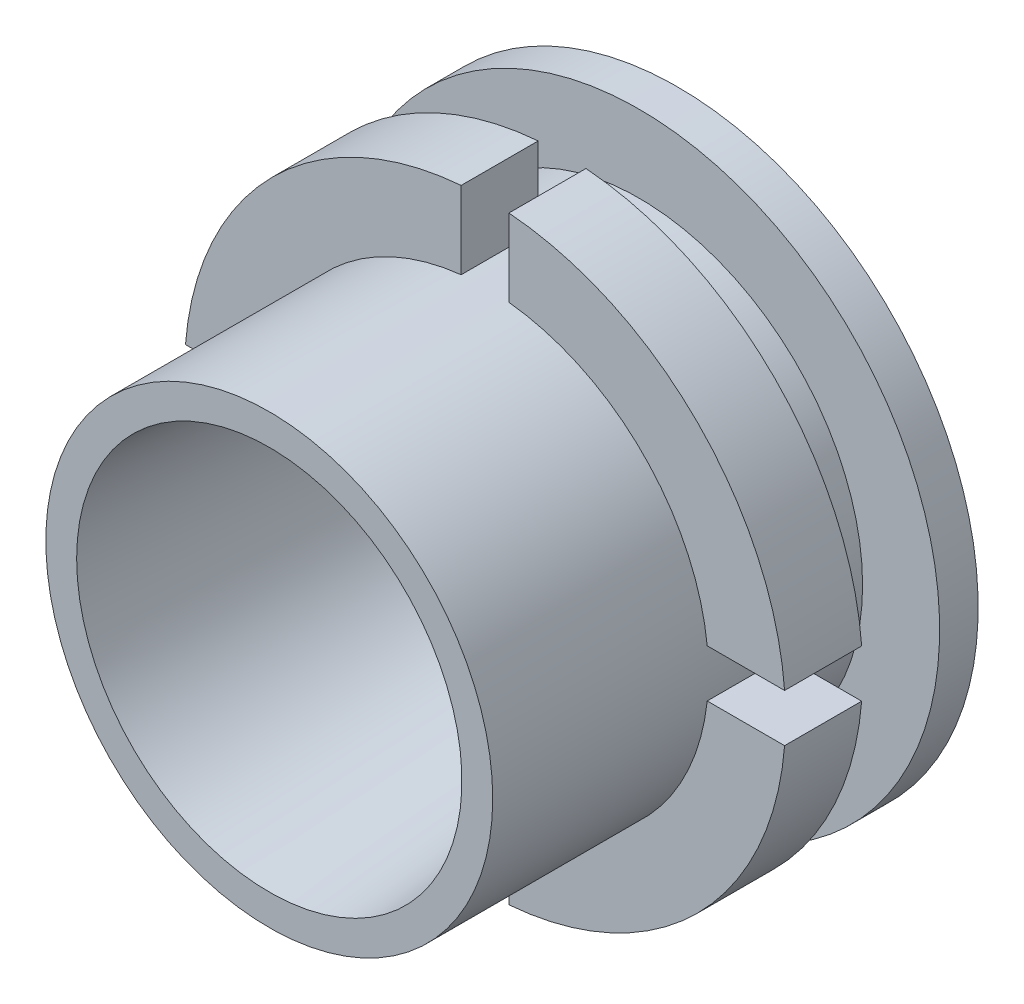
ISO-10303-21;
HEADER;
FILE_DESCRIPTION(('STEP AP214'),'2;1');
FILE_NAME('part.step','',(''),(''),'','','');
FILE_SCHEMA(('AUTOMOTIVE_DESIGN { 1 0 10303 214 1 1 1 1 }'));
ENDSEC;
DATA;
#1=APPLICATION_CONTEXT('core data for automotive mechanical design processes');
#2=APPLICATION_PROTOCOL_DEFINITION('international standard','automotive_design',2000,#1);
#3=PRODUCT_CONTEXT('',#1,'mechanical');
#4=PRODUCT('Part','Part','',(#3));
#5=PRODUCT_RELATED_PRODUCT_CATEGORY('part','',(#4));
#6=PRODUCT_DEFINITION_FORMATION('','',#4);
#7=PRODUCT_DEFINITION_CONTEXT('part definition',#1,'design');
#8=PRODUCT_DEFINITION('design','',#6,#7);
#9=PRODUCT_DEFINITION_SHAPE('','',#8);
#10=(LENGTH_UNIT() NAMED_UNIT(*) SI_UNIT(.MILLI.,.METRE.));
#11=(NAMED_UNIT(*) PLANE_ANGLE_UNIT() SI_UNIT($,.RADIAN.));
#12=(NAMED_UNIT(*) SI_UNIT($,.STERADIAN.) SOLID_ANGLE_UNIT());
#13=UNCERTAINTY_MEASURE_WITH_UNIT(LENGTH_MEASURE(1.E-05),#10,'distance_accuracy_value','');
#14=(GEOMETRIC_REPRESENTATION_CONTEXT(3) GLOBAL_UNCERTAINTY_ASSIGNED_CONTEXT((#13)) GLOBAL_UNIT_ASSIGNED_CONTEXT((#10,
#11,#12)) REPRESENTATION_CONTEXT('',''));
#15=CARTESIAN_POINT('',(0.,0.,0.));
#16=DIRECTION('',(0.,0.,1.));
#17=DIRECTION('',(1.,0.,0.));
#18=AXIS2_PLACEMENT_3D('',#15,#16,#17);
#19=CARTESIAN_POINT('',(0.,0.,-28.));
#20=DIRECTION('',(0.,0.,-1.));
#21=DIRECTION('',(-1.,0.,0.));
#22=AXIS2_PLACEMENT_3D('',#19,#20,#21);
#23=CYLINDRICAL_SURFACE('',#22,39.);
#24=DIRECTION('',(0.,0.,-1.));
#25=VECTOR('',#24,1.);
#26=CARTESIAN_POINT('',(-38.8765996455451,3.09999999999986,-28.));
#27=LINE('',#26,#25);
#28=CARTESIAN_POINT('',(-38.8765996455451,3.09999999999986,-28.));
#29=VERTEX_POINT('',#28);
#30=CARTESIAN_POINT('',(-38.8765996455451,3.09999999999986,-38.));
#31=VERTEX_POINT('',#30);
#32=EDGE_CURVE('E204',#29,#31,#27,.T.);
#33=ORIENTED_EDGE('',*,*,#32,.F.);
#34=CARTESIAN_POINT('',(0.,0.,-28.));
#35=DIRECTION('',(0.,0.,-1.));
#36=DIRECTION('',(-1.,0.,0.));
#37=AXIS2_PLACEMENT_3D('',#34,#35,#36);
#38=CIRCLE('',#37,39.);
#39=CARTESIAN_POINT('',(-3.1,38.8765996455451,-28.));
#40=VERTEX_POINT('',#39);
#41=EDGE_CURVE('E242',#29,#40,#38,.T.);
#42=ORIENTED_EDGE('',*,*,#41,.T.);
#43=DIRECTION('',(0.,0.,-1.));
#44=VECTOR('',#43,1.);
#45=CARTESIAN_POINT('',(-3.1,38.8765996455451,-28.));
#46=LINE('',#45,#44);
#47=CARTESIAN_POINT('',(-3.1,38.8765996455451,-38.));
#48=VERTEX_POINT('',#47);
#49=EDGE_CURVE('E195',#48,#40,#46,.F.);
#50=ORIENTED_EDGE('',*,*,#49,.F.);
#51=CARTESIAN_POINT('',(0.,0.,-38.));
#52=DIRECTION('',(0.,0.,-1.));
#53=DIRECTION('',(-1.,0.,0.));
#54=AXIS2_PLACEMENT_3D('',#51,#52,#53);
#55=CIRCLE('',#54,39.);
#56=EDGE_CURVE('E173',#31,#48,#55,.T.);
#57=ORIENTED_EDGE('',*,*,#56,.F.);
#58=EDGE_LOOP('',(#33,#42,#50,#57));
#59=FACE_BOUND('',#58,.T.);
#60=ADVANCED_FACE('F35',(#59),#23,.T.);
#61=DIRECTION('',(0.,0.,-1.));
#62=VECTOR('',#61,1.);
#63=CARTESIAN_POINT('',(-38.8765996455451,-3.10000000000013,-28.));
#64=LINE('',#63,#62);
#65=CARTESIAN_POINT('',(-38.8765996455451,-3.10000000000014,-38.));
#66=VERTEX_POINT('',#65);
#67=CARTESIAN_POINT('',(-38.8765996455451,-3.10000000000013,-28.));
#68=VERTEX_POINT('',#67);
#69=EDGE_CURVE('E209',#66,#68,#64,.F.);
#70=ORIENTED_EDGE('',*,*,#69,.F.);
#71=CARTESIAN_POINT('',(-3.1,-38.8765996455451,-38.));
#72=VERTEX_POINT('',#71);
#73=EDGE_CURVE('E177',#72,#66,#55,.T.);
#74=ORIENTED_EDGE('',*,*,#73,.F.);
#75=DIRECTION('',(0.,0.,-1.));
#76=VECTOR('',#75,1.);
#77=CARTESIAN_POINT('',(-3.1,-38.8765996455451,-28.));
#78=LINE('',#77,#76);
#79=CARTESIAN_POINT('',(-3.1,-38.8765996455451,-28.));
#80=VERTEX_POINT('',#79);
#81=EDGE_CURVE('E214',#80,#72,#78,.T.);
#82=ORIENTED_EDGE('',*,*,#81,.F.);
#83=EDGE_CURVE('E283',#80,#68,#38,.T.);
#84=ORIENTED_EDGE('',*,*,#83,.T.);
#85=EDGE_LOOP('',(#70,#74,#82,#84));
#86=FACE_BOUND('',#85,.T.);
#87=ADVANCED_FACE('F280',(#86),#23,.T.);
#88=DIRECTION('',(0.,0.,-1.));
#89=VECTOR('',#88,1.);
#90=CARTESIAN_POINT('',(3.1,-38.8765996455451,-28.));
#91=LINE('',#90,#89);
#92=CARTESIAN_POINT('',(3.1,-38.8765996455451,-38.));
#93=VERTEX_POINT('',#92);
#94=CARTESIAN_POINT('',(3.1,-38.8765996455451,-28.));
#95=VERTEX_POINT('',#94);
#96=EDGE_CURVE('E219',#93,#95,#91,.F.);
#97=ORIENTED_EDGE('',*,*,#96,.F.);
#98=CARTESIAN_POINT('',(38.8765996455452,-3.09999999999959,-38.));
#99=VERTEX_POINT('',#98);
#100=EDGE_CURVE('E286',#99,#93,#55,.T.);
#101=ORIENTED_EDGE('',*,*,#100,.F.);
#102=DIRECTION('',(0.,0.,-1.));
#103=VECTOR('',#102,1.);
#104=CARTESIAN_POINT('',(38.8765996455452,-3.09999999999959,-28.));
#105=LINE('',#104,#103);
#106=CARTESIAN_POINT('',(38.8765996455452,-3.09999999999959,-28.));
#107=VERTEX_POINT('',#106);
#108=EDGE_CURVE('E160',#107,#99,#105,.T.);
#109=ORIENTED_EDGE('',*,*,#108,.F.);
#110=EDGE_CURVE('E376',#107,#95,#38,.T.);
#111=ORIENTED_EDGE('',*,*,#110,.T.);
#112=EDGE_LOOP('',(#97,#101,#109,#111));
#113=FACE_BOUND('',#112,.T.);
#114=ADVANCED_FACE('F352',(#113),#23,.T.);
#115=CARTESIAN_POINT('',(0.,0.,-28.));
#116=DIRECTION('',(0.,0.,-1.));
#117=DIRECTION('',(-1.,0.,0.));
#118=AXIS2_PLACEMENT_3D('',#115,#116,#117);
#119=PLANE('',#118);
#120=ORIENTED_EDGE('',*,*,#41,.F.);
#121=DIRECTION('',(1.,0.,0.));
#122=VECTOR('',#121,1.);
#123=CARTESIAN_POINT('',(0.,3.1,-28.));
#124=LINE('',#123,#122);
#125=CARTESIAN_POINT('',(-28.8338342923726,3.0999999999999,-28.));
#126=VERTEX_POINT('',#125);
#127=EDGE_CURVE('E201',#29,#126,#124,.T.);
#128=ORIENTED_EDGE('',*,*,#127,.T.);
#129=CARTESIAN_POINT('',(0.,0.,-28.));
#130=DIRECTION('',(0.,0.,-1.));
#131=DIRECTION('',(-1.,0.,0.));
#132=AXIS2_PLACEMENT_3D('',#129,#130,#131);
#133=CIRCLE('',#132,29.);
#134=CARTESIAN_POINT('',(-3.1,28.8338342923726,-28.));
#135=VERTEX_POINT('',#134);
#136=EDGE_CURVE('E176',#126,#135,#133,.T.);
#137=ORIENTED_EDGE('',*,*,#136,.T.);
#138=DIRECTION('',(0.,1.,0.));
#139=VECTOR('',#138,1.);
#140=CARTESIAN_POINT('',(-3.1,0.,-28.));
#141=LINE('',#140,#139);
#142=EDGE_CURVE('E191',#135,#40,#141,.T.);
#143=ORIENTED_EDGE('',*,*,#142,.T.);
#144=EDGE_LOOP('',(#120,#128,#137,#143));
#145=FACE_BOUND('',#144,.T.);
#146=ADVANCED_FACE('F241',(#145),#119,.F.);
#147=CARTESIAN_POINT('',(-3.1,-28.8338342923726,-28.));
#148=VERTEX_POINT('',#147);
#149=CARTESIAN_POINT('',(-28.8338342923726,-3.1000000000001,-28.));
#150=VERTEX_POINT('',#149);
#151=EDGE_CURVE('E181',#148,#150,#133,.T.);
#152=ORIENTED_EDGE('',*,*,#151,.T.);
#153=DIRECTION('',(-1.,0.,0.));
#154=VECTOR('',#153,1.);
#155=CARTESIAN_POINT('',(0.,-3.1,-28.));
#156=LINE('',#155,#154);
#157=EDGE_CURVE('E206',#150,#68,#156,.T.);
#158=ORIENTED_EDGE('',*,*,#157,.T.);
#159=ORIENTED_EDGE('',*,*,#83,.F.);
#160=DIRECTION('',(0.,1.,0.));
#161=VECTOR('',#160,1.);
#162=CARTESIAN_POINT('',(-3.1,0.,-28.));
#163=LINE('',#162,#161);
#164=EDGE_CURVE('E211',#80,#148,#163,.T.);
#165=ORIENTED_EDGE('',*,*,#164,.T.);
#166=EDGE_LOOP('',(#152,#158,#159,#165));
#167=FACE_BOUND('',#166,.T.);
#168=ADVANCED_FACE('F370',(#167),#119,.F.);
#169=CARTESIAN_POINT('',(28.8338342923726,-3.0999999999997,-28.));
#170=VERTEX_POINT('',#169);
#171=CARTESIAN_POINT('',(3.1,-28.8338342923726,-28.));
#172=VERTEX_POINT('',#171);
#173=EDGE_CURVE('E174',#170,#172,#133,.T.);
#174=ORIENTED_EDGE('',*,*,#173,.T.);
#175=DIRECTION('',(0.,-1.,0.));
#176=VECTOR('',#175,1.);
#177=CARTESIAN_POINT('',(3.1,0.,-28.));
#178=LINE('',#177,#176);
#179=EDGE_CURVE('E216',#172,#95,#178,.T.);
#180=ORIENTED_EDGE('',*,*,#179,.T.);
#181=ORIENTED_EDGE('',*,*,#110,.F.);
#182=DIRECTION('',(-1.,0.,0.));
#183=VECTOR('',#182,1.);
#184=CARTESIAN_POINT('',(0.,-3.1,-28.));
#185=LINE('',#184,#183);
#186=EDGE_CURVE('E221',#107,#170,#185,.T.);
#187=ORIENTED_EDGE('',*,*,#186,.T.);
#188=EDGE_LOOP('',(#174,#180,#181,#187));
#189=FACE_BOUND('',#188,.T.);
#190=ADVANCED_FACE('F362',(#189),#119,.F.);
#191=CARTESIAN_POINT('',(0.,0.,-38.));
#192=DIRECTION('',(0.,0.,-1.));
#193=DIRECTION('',(-1.,0.,0.));
#194=AXIS2_PLACEMENT_3D('',#191,#192,#193);
#195=PLANE('',#194);
#196=DIRECTION('',(1.,0.,0.));
#197=VECTOR('',#196,1.);
#198=CARTESIAN_POINT('',(0.,3.1,-38.));
#199=LINE('',#198,#197);
#200=CARTESIAN_POINT('',(-28.8338342923726,3.0999999999999,-38.));
#201=VERTEX_POINT('',#200);
#202=EDGE_CURVE('E11',#31,#201,#199,.T.);
#203=ORIENTED_EDGE('',*,*,#202,.F.);
#204=ORIENTED_EDGE('',*,*,#56,.T.);
#205=DIRECTION('',(0.,1.,0.));
#206=VECTOR('',#205,1.);
#207=CARTESIAN_POINT('',(-3.1,0.,-38.));
#208=LINE('',#207,#206);
#209=CARTESIAN_POINT('',(-3.1,28.8338342923726,-38.));
#210=VERTEX_POINT('',#209);
#211=EDGE_CURVE('E249',#210,#48,#208,.T.);
#212=ORIENTED_EDGE('',*,*,#211,.F.);
#213=CARTESIAN_POINT('',(0.,0.,-38.));
#214=DIRECTION('',(0.,0.,-1.));
#215=DIRECTION('',(-1.,0.,0.));
#216=AXIS2_PLACEMENT_3D('',#213,#214,#215);
#217=CIRCLE('',#216,29.);
#218=EDGE_CURVE('E244',#210,#201,#217,.F.);
#219=ORIENTED_EDGE('',*,*,#218,.T.);
#220=EDGE_LOOP('',(#203,#204,#212,#219));
#221=FACE_BOUND('',#220,.T.);
#222=ADVANCED_FACE('F252',(#221),#195,.T.);
#223=DIRECTION('',(-1.,0.,0.));
#224=VECTOR('',#223,1.);
#225=CARTESIAN_POINT('',(0.,-3.1,-38.));
#226=LINE('',#225,#224);
#227=CARTESIAN_POINT('',(-28.8338342923726,-3.1000000000001,-38.));
#228=VERTEX_POINT('',#227);
#229=EDGE_CURVE('E43',#228,#66,#226,.T.);
#230=ORIENTED_EDGE('',*,*,#229,.F.);
#231=CARTESIAN_POINT('',(-3.1,-28.8338342923726,-38.));
#232=VERTEX_POINT('',#231);
#233=EDGE_CURVE('E259',#228,#232,#217,.F.);
#234=ORIENTED_EDGE('',*,*,#233,.T.);
#235=DIRECTION('',(0.,1.,0.));
#236=VECTOR('',#235,1.);
#237=CARTESIAN_POINT('',(-3.1,0.,-38.));
#238=LINE('',#237,#236);
#239=EDGE_CURVE('E268',#72,#232,#238,.T.);
#240=ORIENTED_EDGE('',*,*,#239,.F.);
#241=ORIENTED_EDGE('',*,*,#73,.T.);
#242=EDGE_LOOP('',(#230,#234,#240,#241));
#243=FACE_BOUND('',#242,.T.);
#244=ADVANCED_FACE('F285',(#243),#195,.T.);
#245=DIRECTION('',(0.,-1.,0.));
#246=VECTOR('',#245,1.);
#247=CARTESIAN_POINT('',(3.1,0.,-38.));
#248=LINE('',#247,#246);
#249=CARTESIAN_POINT('',(3.1,-28.8338342923726,-38.));
#250=VERTEX_POINT('',#249);
#251=EDGE_CURVE('E266',#250,#93,#248,.T.);
#252=ORIENTED_EDGE('',*,*,#251,.F.);
#253=CARTESIAN_POINT('',(28.8338342923726,-3.0999999999997,-38.));
#254=VERTEX_POINT('',#253);
#255=EDGE_CURVE('E381',#250,#254,#217,.F.);
#256=ORIENTED_EDGE('',*,*,#255,.T.);
#257=DIRECTION('',(-1.,0.,0.));
#258=VECTOR('',#257,1.);
#259=CARTESIAN_POINT('',(0.,-3.1,-38.));
#260=LINE('',#259,#258);
#261=EDGE_CURVE('E264',#99,#254,#260,.T.);
#262=ORIENTED_EDGE('',*,*,#261,.F.);
#263=ORIENTED_EDGE('',*,*,#100,.T.);
#264=EDGE_LOOP('',(#252,#256,#262,#263));
#265=FACE_BOUND('',#264,.T.);
#266=ADVANCED_FACE('F338',(#265),#195,.T.);
#267=CARTESIAN_POINT('',(0.,0.,-53.));
#268=DIRECTION('',(0.,0.,1.));
#269=DIRECTION('',(1.,0.,0.));
#270=AXIS2_PLACEMENT_3D('',#267,#268,#269);
#271=CYLINDRICAL_SURFACE('',#270,29.);
#272=ORIENTED_EDGE('',*,*,#136,.F.);
#273=DIRECTION('',(0.,0.,1.));
#274=VECTOR('',#273,1.);
#275=CARTESIAN_POINT('',(-28.8338342923726,3.0999999999999,-53.));
#276=LINE('',#275,#274);
#277=EDGE_CURVE('E225',#201,#126,#276,.T.);
#278=ORIENTED_EDGE('',*,*,#277,.F.);
#279=ORIENTED_EDGE('',*,*,#218,.F.);
#280=DIRECTION('',(0.,0.,1.));
#281=VECTOR('',#280,1.);
#282=CARTESIAN_POINT('',(-3.1,28.8338342923726,-53.));
#283=LINE('',#282,#281);
#284=EDGE_CURVE('E199',#135,#210,#283,.F.);
#285=ORIENTED_EDGE('',*,*,#284,.F.);
#286=EDGE_LOOP('',(#272,#278,#279,#285));
#287=FACE_BOUND('',#286,.T.);
#288=ORIENTED_EDGE('',*,*,#233,.F.);
#289=DIRECTION('',(0.,0.,1.));
#290=VECTOR('',#289,1.);
#291=CARTESIAN_POINT('',(-28.8338342923726,-3.1000000000001,-53.));
#292=LINE('',#291,#290);
#293=EDGE_CURVE('E231',#150,#228,#292,.F.);
#294=ORIENTED_EDGE('',*,*,#293,.F.);
#295=ORIENTED_EDGE('',*,*,#151,.F.);
#296=DIRECTION('',(0.,0.,1.));
#297=VECTOR('',#296,1.);
#298=CARTESIAN_POINT('',(-3.1,-28.8338342923726,-53.));
#299=LINE('',#298,#297);
#300=EDGE_CURVE('E58',#232,#148,#299,.T.);
#301=ORIENTED_EDGE('',*,*,#300,.F.);
#302=EDGE_LOOP('',(#288,#294,#295,#301));
#303=FACE_BOUND('',#302,.T.);
#304=ORIENTED_EDGE('',*,*,#255,.F.);
#305=DIRECTION('',(0.,0.,1.));
#306=VECTOR('',#305,1.);
#307=CARTESIAN_POINT('',(3.1,-28.8338342923726,-53.));
#308=LINE('',#307,#306);
#309=EDGE_CURVE('E228',#172,#250,#308,.F.);
#310=ORIENTED_EDGE('',*,*,#309,.F.);
#311=ORIENTED_EDGE('',*,*,#173,.F.);
#312=DIRECTION('',(0.,0.,1.));
#313=VECTOR('',#312,1.);
#314=CARTESIAN_POINT('',(28.8338342923726,-3.0999999999997,-53.));
#315=LINE('',#314,#313);
#316=EDGE_CURVE('E50',#254,#170,#315,.T.);
#317=ORIENTED_EDGE('',*,*,#316,.F.);
#318=EDGE_LOOP('',(#304,#310,#311,#317));
#319=FACE_BOUND('',#318,.T.);
#320=CARTESIAN_POINT('',(28.8338342923725,3.1000000000003,-38.));
#321=VERTEX_POINT('',#320);
#322=CARTESIAN_POINT('',(3.1,28.8338342923726,-38.));
#323=VERTEX_POINT('',#322);
#324=EDGE_CURVE('E168',#321,#323,#217,.F.);
#325=ORIENTED_EDGE('',*,*,#324,.F.);
#326=DIRECTION('',(0.,0.,1.));
#327=VECTOR('',#326,1.);
#328=CARTESIAN_POINT('',(28.8338342923725,3.1000000000003,-53.));
#329=LINE('',#328,#327);
#330=CARTESIAN_POINT('',(28.8338342923725,3.1000000000003,-28.));
#331=VERTEX_POINT('',#330);
#332=EDGE_CURVE('E152',#331,#321,#329,.F.);
#333=ORIENTED_EDGE('',*,*,#332,.F.);
#334=CARTESIAN_POINT('',(3.1,28.8338342923726,-28.));
#335=VERTEX_POINT('',#334);
#336=EDGE_CURVE('E167',#335,#331,#133,.T.);
#337=ORIENTED_EDGE('',*,*,#336,.F.);
#338=DIRECTION('',(0.,0.,1.));
#339=VECTOR('',#338,1.);
#340=CARTESIAN_POINT('',(3.1,28.8338342923726,-53.));
#341=LINE('',#340,#339);
#342=EDGE_CURVE('E198',#323,#335,#341,.T.);
#343=ORIENTED_EDGE('',*,*,#342,.F.);
#344=EDGE_LOOP('',(#325,#333,#337,#343));
#345=FACE_BOUND('',#344,.T.);
#346=CARTESIAN_POINT('',(0.,0.,-48.));
#347=DIRECTION('',(0.,0.,-1.));
#348=DIRECTION('',(-1.,0.,0.));
#349=AXIS2_PLACEMENT_3D('',#346,#347,#348);
#350=CIRCLE('',#349,29.);
#351=CARTESIAN_POINT('',(-29.,0.,-48.));
#352=VERTEX_POINT('',#351);
#353=EDGE_CURVE('E291',#352,#352,#350,.T.);
#354=ORIENTED_EDGE('',*,*,#353,.F.);
#355=EDGE_LOOP('',(#354));
#356=FACE_BOUND('',#355,.T.);
#357=CARTESIAN_POINT('',(0.,0.,0.));
#358=DIRECTION('',(0.,0.,1.));
#359=DIRECTION('',(1.,0.,0.));
#360=AXIS2_PLACEMENT_3D('',#357,#358,#359);
#361=CIRCLE('',#360,29.);
#362=CARTESIAN_POINT('',(29.,0.,0.));
#363=VERTEX_POINT('',#362);
#364=EDGE_CURVE('E314',#363,#363,#361,.T.);
#365=ORIENTED_EDGE('',*,*,#364,.F.);
#366=EDGE_LOOP('',(#365));
#367=FACE_BOUND('',#366,.T.);
#368=ADVANCED_FACE('F37',(#287,#303,#319,#345,#356,#367),#271,.T.);
#369=CARTESIAN_POINT('',(0.,0.,0.));
#370=DIRECTION('',(0.,0.,1.));
#371=DIRECTION('',(-1.,0.,0.));
#372=AXIS2_PLACEMENT_3D('',#369,#370,#371);
#373=CONICAL_SURFACE('',#372,25.,0.0872664625997167);
#374=CARTESIAN_POINT('',(0.,0.,-38.5));
#375=DIRECTION('',(0.,0.,1.));
#376=DIRECTION('',(1.,0.,0.));
#377=AXIS2_PLACEMENT_3D('',#374,#375,#376);
#378=CIRCLE('',#377,21.6316864542519);
#379=CARTESIAN_POINT('',(21.6316864542519,0.,-38.5));
#380=VERTEX_POINT('',#379);
#381=EDGE_CURVE('E311',#380,#380,#378,.T.);
#382=ORIENTED_EDGE('',*,*,#381,.F.);
#383=EDGE_LOOP('',(#382));
#384=FACE_BOUND('',#383,.T.);
#385=CARTESIAN_POINT('',(0.,0.,0.));
#386=DIRECTION('',(0.,0.,-1.));
#387=DIRECTION('',(-1.,0.,0.));
#388=AXIS2_PLACEMENT_3D('',#385,#386,#387);
#389=CIRCLE('',#388,25.);
#390=CARTESIAN_POINT('',(-25.,0.,0.));
#391=VERTEX_POINT('',#390);
#392=EDGE_CURVE('E307',#391,#391,#389,.T.);
#393=ORIENTED_EDGE('',*,*,#392,.F.);
#394=EDGE_LOOP('',(#393));
#395=FACE_BOUND('',#394,.T.);
#396=ADVANCED_FACE('F324',(#384,#395),#373,.F.);
#397=CARTESIAN_POINT('',(0.,0.,-53.));
#398=DIRECTION('',(0.,0.,1.));
#399=DIRECTION('',(1.,0.,0.));
#400=AXIS2_PLACEMENT_3D('',#397,#398,#399);
#401=PLANE('',#400);
#402=CARTESIAN_POINT('',(0.,0.,-53.));
#403=DIRECTION('',(0.,0.,-1.));
#404=DIRECTION('',(-1.,0.,0.));
#405=AXIS2_PLACEMENT_3D('',#402,#403,#404);
#406=CIRCLE('',#405,20.363100833126);
#407=CARTESIAN_POINT('',(-20.363100833126,0.,-53.));
#408=VERTEX_POINT('',#407);
#409=EDGE_CURVE('E310',#408,#408,#406,.T.);
#410=ORIENTED_EDGE('',*,*,#409,.F.);
#411=EDGE_LOOP('',(#410));
#412=FACE_BOUND('',#411,.T.);
#413=CARTESIAN_POINT('',(0.,0.,-53.));
#414=DIRECTION('',(0.,0.,-1.));
#415=DIRECTION('',(-1.,0.,0.));
#416=AXIS2_PLACEMENT_3D('',#413,#414,#415);
#417=CIRCLE('',#416,39.);
#418=CARTESIAN_POINT('',(-39.,0.,-53.));
#419=VERTEX_POINT('',#418);
#420=EDGE_CURVE('E294',#419,#419,#417,.T.);
#421=ORIENTED_EDGE('',*,*,#420,.T.);
#422=EDGE_LOOP('',(#421));
#423=FACE_BOUND('',#422,.T.);
#424=ADVANCED_FACE('F327',(#412,#423),#401,.F.);
#425=CARTESIAN_POINT('',(0.,0.,0.));
#426=DIRECTION('',(0.,0.,1.));
#427=DIRECTION('',(1.,0.,0.));
#428=AXIS2_PLACEMENT_3D('',#425,#426,#427);
#429=PLANE('',#428);
#430=ORIENTED_EDGE('',*,*,#392,.T.);
#431=EDGE_LOOP('',(#430));
#432=FACE_BOUND('',#431,.T.);
#433=ORIENTED_EDGE('',*,*,#364,.T.);
#434=EDGE_LOOP('',(#433));
#435=FACE_BOUND('',#434,.T.);
#436=ADVANCED_FACE('F332',(#432,#435),#429,.T.);
#437=CARTESIAN_POINT('',(0.,0.,-41.5));
#438=DIRECTION('',(0.,0.,-1.));
#439=DIRECTION('',(-1.,0.,0.));
#440=AXIS2_PLACEMENT_3D('',#437,#438,#439);
#441=CIRCLE('',#440,21.3692204636742);
#442=CARTESIAN_POINT('',(-21.3692204636742,0.,-41.5));
#443=VERTEX_POINT('',#442);
#444=EDGE_CURVE('E306',#443,#443,#441,.T.);
#445=ORIENTED_EDGE('',*,*,#444,.F.);
#446=EDGE_LOOP('',(#445));
#447=FACE_BOUND('',#446,.T.);
#448=ORIENTED_EDGE('',*,*,#409,.T.);
#449=EDGE_LOOP('',(#448));
#450=FACE_BOUND('',#449,.T.);
#451=ADVANCED_FACE('F329',(#447,#450),#373,.F.);
#452=CARTESIAN_POINT('',(0.,0.,-40.));
#453=DIRECTION('',(0.,0.,-1.));
#454=DIRECTION('',(-1.,0.,0.));
#455=AXIS2_PLACEMENT_3D('',#452,#453,#454);
#456=TOROIDAL_SURFACE('',#455,22.,1.5);
#457=CARTESIAN_POINT('',(0.,0.,-38.5));
#458=DIRECTION('',(0.,0.,-1.));
#459=DIRECTION('',(-1.,0.,0.));
#460=AXIS2_PLACEMENT_3D('',#457,#458,#459);
#461=CIRCLE('',#460,22.);
#462=CARTESIAN_POINT('',(-22.,0.,-38.5));
#463=VERTEX_POINT('',#462);
#464=EDGE_CURVE('E303',#463,#463,#461,.T.);
#465=ORIENTED_EDGE('',*,*,#464,.F.);
#466=EDGE_LOOP('',(#465));
#467=FACE_BOUND('',#466,.T.);
#468=CARTESIAN_POINT('',(0.,0.,-41.5));
#469=DIRECTION('',(0.,0.,-1.));
#470=DIRECTION('',(-1.,0.,0.));
#471=AXIS2_PLACEMENT_3D('',#468,#469,#470);
#472=CIRCLE('',#471,22.);
#473=CARTESIAN_POINT('',(-22.,0.,-41.5));
#474=VERTEX_POINT('',#473);
#475=EDGE_CURVE('E298',#474,#474,#472,.T.);
#476=ORIENTED_EDGE('',*,*,#475,.T.);
#477=EDGE_LOOP('',(#476));
#478=FACE_BOUND('',#477,.T.);
#479=ADVANCED_FACE('F502',(#467,#478),#456,.F.);
#480=CARTESIAN_POINT('',(0.,20.5,-38.5));
#481=DIRECTION('',(0.,0.,1.));
#482=DIRECTION('',(1.,0.,0.));
#483=AXIS2_PLACEMENT_3D('',#480,#481,#482);
#484=PLANE('',#483);
#485=ORIENTED_EDGE('',*,*,#381,.T.);
#486=EDGE_LOOP('',(#485));
#487=FACE_BOUND('',#486,.T.);
#488=ORIENTED_EDGE('',*,*,#464,.T.);
#489=EDGE_LOOP('',(#488));
#490=FACE_BOUND('',#489,.T.);
#491=ADVANCED_FACE('F321',(#487,#490),#484,.F.);
#492=CARTESIAN_POINT('',(0.,22.,-41.5));
#493=DIRECTION('',(0.,0.,-1.));
#494=DIRECTION('',(-1.,0.,0.));
#495=AXIS2_PLACEMENT_3D('',#492,#493,#494);
#496=PLANE('',#495);
#497=ORIENTED_EDGE('',*,*,#444,.T.);
#498=EDGE_LOOP('',(#497));
#499=FACE_BOUND('',#498,.T.);
#500=ORIENTED_EDGE('',*,*,#475,.F.);
#501=EDGE_LOOP('',(#500));
#502=FACE_BOUND('',#501,.T.);
#503=ADVANCED_FACE('F472',(#499,#502),#496,.F.);
#504=CARTESIAN_POINT('',(0.,0.,-48.));
#505=DIRECTION('',(0.,0.,-1.));
#506=DIRECTION('',(-1.,0.,0.));
#507=AXIS2_PLACEMENT_3D('',#504,#505,#506);
#508=CYLINDRICAL_SURFACE('',#507,39.);
#509=CARTESIAN_POINT('',(0.,0.,-48.));
#510=DIRECTION('',(0.,0.,-1.));
#511=DIRECTION('',(-1.,0.,0.));
#512=AXIS2_PLACEMENT_3D('',#509,#510,#511);
#513=CIRCLE('',#512,39.);
#514=CARTESIAN_POINT('',(-39.,0.,-48.));
#515=VERTEX_POINT('',#514);
#516=EDGE_CURVE('E295',#515,#515,#513,.T.);
#517=ORIENTED_EDGE('',*,*,#516,.T.);
#518=EDGE_LOOP('',(#517));
#519=FACE_BOUND('',#518,.T.);
#520=ORIENTED_EDGE('',*,*,#420,.F.);
#521=EDGE_LOOP('',(#520));
#522=FACE_BOUND('',#521,.T.);
#523=ADVANCED_FACE('F363',(#519,#522),#508,.T.);
#524=CARTESIAN_POINT('',(0.,0.,-48.));
#525=DIRECTION('',(0.,0.,-1.));
#526=DIRECTION('',(-1.,0.,0.));
#527=AXIS2_PLACEMENT_3D('',#524,#525,#526);
#528=PLANE('',#527);
#529=ORIENTED_EDGE('',*,*,#353,.T.);
#530=EDGE_LOOP('',(#529));
#531=FACE_BOUND('',#530,.T.);
#532=ORIENTED_EDGE('',*,*,#516,.F.);
#533=EDGE_LOOP('',(#532));
#534=FACE_BOUND('',#533,.T.);
#535=ADVANCED_FACE('F355',(#531,#534),#528,.F.);
#536=DIRECTION('',(0.,0.,-1.));
#537=VECTOR('',#536,1.);
#538=CARTESIAN_POINT('',(38.8765996455451,3.10000000000041,-28.));
#539=LINE('',#538,#537);
#540=CARTESIAN_POINT('',(38.8765996455451,3.10000000000041,-38.));
#541=VERTEX_POINT('',#540);
#542=CARTESIAN_POINT('',(38.8765996455451,3.10000000000041,-28.));
#543=VERTEX_POINT('',#542);
#544=EDGE_CURVE('E155',#541,#543,#539,.F.);
#545=ORIENTED_EDGE('',*,*,#544,.F.);
#546=CARTESIAN_POINT('',(3.1,38.8765996455451,-38.));
#547=VERTEX_POINT('',#546);
#548=EDGE_CURVE('E179',#547,#541,#55,.T.);
#549=ORIENTED_EDGE('',*,*,#548,.F.);
#550=DIRECTION('',(0.,0.,-1.));
#551=VECTOR('',#550,1.);
#552=CARTESIAN_POINT('',(3.1,38.8765996455451,-28.));
#553=LINE('',#552,#551);
#554=CARTESIAN_POINT('',(3.1,38.8765996455451,-28.));
#555=VERTEX_POINT('',#554);
#556=EDGE_CURVE('E190',#555,#547,#553,.T.);
#557=ORIENTED_EDGE('',*,*,#556,.F.);
#558=EDGE_CURVE('E290',#555,#543,#38,.T.);
#559=ORIENTED_EDGE('',*,*,#558,.T.);
#560=EDGE_LOOP('',(#545,#549,#557,#559));
#561=FACE_BOUND('',#560,.T.);
#562=ADVANCED_FACE('F348',(#561),#23,.T.);
#563=ORIENTED_EDGE('',*,*,#336,.T.);
#564=DIRECTION('',(1.,0.,0.));
#565=VECTOR('',#564,1.);
#566=CARTESIAN_POINT('',(0.,3.1,-28.));
#567=LINE('',#566,#565);
#568=EDGE_CURVE('E149',#331,#543,#567,.T.);
#569=ORIENTED_EDGE('',*,*,#568,.T.);
#570=ORIENTED_EDGE('',*,*,#558,.F.);
#571=DIRECTION('',(0.,-1.,0.));
#572=VECTOR('',#571,1.);
#573=CARTESIAN_POINT('',(3.1,0.,-28.));
#574=LINE('',#573,#572);
#575=EDGE_CURVE('E172',#555,#335,#574,.T.);
#576=ORIENTED_EDGE('',*,*,#575,.T.);
#577=EDGE_LOOP('',(#563,#569,#570,#576));
#578=FACE_BOUND('',#577,.T.);
#579=ADVANCED_FACE('F171',(#578),#119,.F.);
#580=DIRECTION('',(1.,0.,0.));
#581=VECTOR('',#580,1.);
#582=CARTESIAN_POINT('',(0.,3.1,-38.));
#583=LINE('',#582,#581);
#584=EDGE_CURVE('E257',#321,#541,#583,.T.);
#585=ORIENTED_EDGE('',*,*,#584,.F.);
#586=ORIENTED_EDGE('',*,*,#324,.T.);
#587=DIRECTION('',(0.,-1.,0.));
#588=VECTOR('',#587,1.);
#589=CARTESIAN_POINT('',(3.1,0.,-38.));
#590=LINE('',#589,#588);
#591=EDGE_CURVE('E254',#547,#323,#590,.T.);
#592=ORIENTED_EDGE('',*,*,#591,.F.);
#593=ORIENTED_EDGE('',*,*,#548,.T.);
#594=EDGE_LOOP('',(#585,#586,#592,#593));
#595=FACE_BOUND('',#594,.T.);
#596=ADVANCED_FACE('F344',(#595),#195,.T.);
#597=CARTESIAN_POINT('',(3.1,-39.001,-22.370835296897));
#598=DIRECTION('',(1.,0.,0.));
#599=DIRECTION('',(0.,0.,-1.));
#600=AXIS2_PLACEMENT_3D('',#597,#598,#599);
#601=PLANE('',#600);
#602=ORIENTED_EDGE('',*,*,#556,.T.);
#603=ORIENTED_EDGE('',*,*,#591,.T.);
#604=ORIENTED_EDGE('',*,*,#342,.T.);
#605=ORIENTED_EDGE('',*,*,#575,.F.);
#606=EDGE_LOOP('',(#602,#603,#604,#605));
#607=FACE_BOUND('',#606,.T.);
#608=ADVANCED_FACE('F389',(#607),#601,.F.);
#609=CARTESIAN_POINT('',(-3.1,-39.001,-42.583113621589));
#610=DIRECTION('',(-1.,0.,0.));
#611=DIRECTION('',(0.,0.,1.));
#612=AXIS2_PLACEMENT_3D('',#609,#610,#611);
#613=PLANE('',#612);
#614=ORIENTED_EDGE('',*,*,#284,.T.);
#615=ORIENTED_EDGE('',*,*,#211,.T.);
#616=ORIENTED_EDGE('',*,*,#49,.T.);
#617=ORIENTED_EDGE('',*,*,#142,.F.);
#618=EDGE_LOOP('',(#614,#615,#616,#617));
#619=FACE_BOUND('',#618,.T.);
#620=ADVANCED_FACE('F248',(#619),#613,.F.);
#621=CARTESIAN_POINT('',(-39.0010000000004,-3.10000000000041,-22.370835296897));
#622=DIRECTION('',(0.,-1.,0.));
#623=DIRECTION('',(1.,0.,0.));
#624=AXIS2_PLACEMENT_3D('',#621,#622,#623);
#625=PLANE('',#624);
#626=ORIENTED_EDGE('',*,*,#108,.T.);
#627=ORIENTED_EDGE('',*,*,#261,.T.);
#628=ORIENTED_EDGE('',*,*,#316,.T.);
#629=ORIENTED_EDGE('',*,*,#186,.F.);
#630=EDGE_LOOP('',(#626,#627,#628,#629));
#631=FACE_BOUND('',#630,.T.);
#632=ADVANCED_FACE('F383',(#631),#625,.F.);
#633=CARTESIAN_POINT('',(-39.0010000000004,3.09999999999959,-42.583113621589));
#634=DIRECTION('',(0.,1.,0.));
#635=DIRECTION('',(-1.,0.,0.));
#636=AXIS2_PLACEMENT_3D('',#633,#634,#635);
#637=PLANE('',#636);
#638=ORIENTED_EDGE('',*,*,#332,.T.);
#639=ORIENTED_EDGE('',*,*,#584,.T.);
#640=ORIENTED_EDGE('',*,*,#544,.T.);
#641=ORIENTED_EDGE('',*,*,#568,.F.);
#642=EDGE_LOOP('',(#638,#639,#640,#641));
#643=FACE_BOUND('',#642,.T.);
#644=ADVANCED_FACE('F151',(#643),#637,.F.);
#645=CARTESIAN_POINT('',(-3.1,39.001,-22.370835296897));
#646=DIRECTION('',(-1.,0.,0.));
#647=DIRECTION('',(0.,0.,1.));
#648=AXIS2_PLACEMENT_3D('',#645,#646,#647);
#649=PLANE('',#648);
#650=ORIENTED_EDGE('',*,*,#81,.T.);
#651=ORIENTED_EDGE('',*,*,#239,.T.);
#652=ORIENTED_EDGE('',*,*,#300,.T.);
#653=ORIENTED_EDGE('',*,*,#164,.F.);
#654=EDGE_LOOP('',(#650,#651,#652,#653));
#655=FACE_BOUND('',#654,.T.);
#656=ADVANCED_FACE('F393',(#655),#649,.F.);
#657=CARTESIAN_POINT('',(3.1,39.001,-42.583113621589));
#658=DIRECTION('',(1.,0.,0.));
#659=DIRECTION('',(0.,0.,-1.));
#660=AXIS2_PLACEMENT_3D('',#657,#658,#659);
#661=PLANE('',#660);
#662=ORIENTED_EDGE('',*,*,#309,.T.);
#663=ORIENTED_EDGE('',*,*,#251,.T.);
#664=ORIENTED_EDGE('',*,*,#96,.T.);
#665=ORIENTED_EDGE('',*,*,#179,.F.);
#666=EDGE_LOOP('',(#662,#663,#664,#665));
#667=FACE_BOUND('',#666,.T.);
#668=ADVANCED_FACE('F395',(#667),#661,.F.);
#669=CARTESIAN_POINT('',(39.0010000000001,3.10000000000014,-22.370835296897));
#670=DIRECTION('',(0.,1.,0.));
#671=DIRECTION('',(-1.,0.,0.));
#672=AXIS2_PLACEMENT_3D('',#669,#670,#671);
#673=PLANE('',#672);
#674=ORIENTED_EDGE('',*,*,#32,.T.);
#675=ORIENTED_EDGE('',*,*,#202,.T.);
#676=ORIENTED_EDGE('',*,*,#277,.T.);
#677=ORIENTED_EDGE('',*,*,#127,.F.);
#678=EDGE_LOOP('',(#674,#675,#676,#677));
#679=FACE_BOUND('',#678,.T.);
#680=ADVANCED_FACE('F234',(#679),#673,.F.);
#681=CARTESIAN_POINT('',(39.0010000000002,-3.09999999999986,-42.583113621589));
#682=DIRECTION('',(0.,-1.,0.));
#683=DIRECTION('',(1.,0.,0.));
#684=AXIS2_PLACEMENT_3D('',#681,#682,#683);
#685=PLANE('',#684);
#686=ORIENTED_EDGE('',*,*,#293,.T.);
#687=ORIENTED_EDGE('',*,*,#229,.T.);
#688=ORIENTED_EDGE('',*,*,#69,.T.);
#689=ORIENTED_EDGE('',*,*,#157,.F.);
#690=EDGE_LOOP('',(#686,#687,#688,#689));
#691=FACE_BOUND('',#690,.T.);
#692=ADVANCED_FACE('F272',(#691),#685,.F.);
#693=CLOSED_SHELL('',(#60,#87,#114,#146,#168,#190,#222,#244,#266,#368,#396,#424,#436,#451,#479,
#491,#503,#523,#535,#562,#579,#596,#608,#620,#632,#644,#656,#668,#680,#692));
#694=MANIFOLD_SOLID_BREP('B2',#693);
#695=ADVANCED_BREP_SHAPE_REPRESENTATION('',(#18,#694),#14);
#696=SHAPE_DEFINITION_REPRESENTATION(#9,#695);
ENDSEC;
END-ISO-10303-21;
